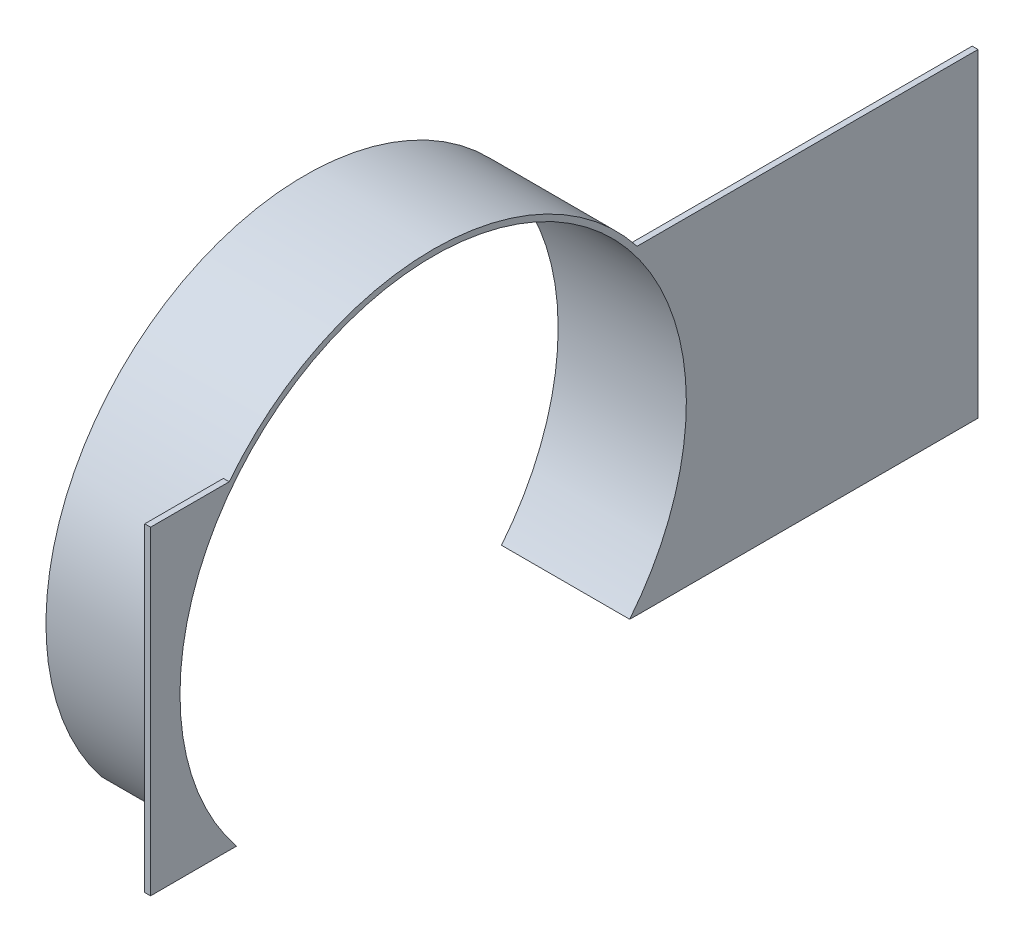
ISO-10303-21;
HEADER;
FILE_DESCRIPTION(('STEP AP214'),'2;1');
FILE_NAME('part.step','',(''),(''),'','','');
FILE_SCHEMA(('AUTOMOTIVE_DESIGN { 1 0 10303 214 1 1 1 1 }'));
ENDSEC;
DATA;
#1=APPLICATION_CONTEXT('core data for automotive mechanical design processes');
#2=APPLICATION_PROTOCOL_DEFINITION('international standard','automotive_design',2000,#1);
#3=PRODUCT_CONTEXT('',#1,'mechanical');
#4=PRODUCT('Part','Part','',(#3));
#5=PRODUCT_RELATED_PRODUCT_CATEGORY('part','',(#4));
#6=PRODUCT_DEFINITION_FORMATION('','',#4);
#7=PRODUCT_DEFINITION_CONTEXT('part definition',#1,'design');
#8=PRODUCT_DEFINITION('design','',#6,#7);
#9=PRODUCT_DEFINITION_SHAPE('','',#8);
#10=(LENGTH_UNIT() NAMED_UNIT(*) SI_UNIT(.MILLI.,.METRE.));
#11=(NAMED_UNIT(*) PLANE_ANGLE_UNIT() SI_UNIT($,.RADIAN.));
#12=(NAMED_UNIT(*) SI_UNIT($,.STERADIAN.) SOLID_ANGLE_UNIT());
#13=UNCERTAINTY_MEASURE_WITH_UNIT(LENGTH_MEASURE(1.E-05),#10,'distance_accuracy_value','');
#14=(GEOMETRIC_REPRESENTATION_CONTEXT(3) GLOBAL_UNCERTAINTY_ASSIGNED_CONTEXT((#13)) GLOBAL_UNIT_ASSIGNED_CONTEXT((#10,
#11,#12)) REPRESENTATION_CONTEXT('',''));
#15=CARTESIAN_POINT('',(0.,0.,0.));
#16=DIRECTION('',(0.,0.,1.));
#17=DIRECTION('',(1.,0.,0.));
#18=AXIS2_PLACEMENT_3D('',#15,#16,#17);
#19=CARTESIAN_POINT('',(-42.000000074,54.7996218405485,24.9974651154864));
#20=DIRECTION('',(1.,0.,0.));
#21=DIRECTION('',(0.,0.,-1.));
#22=AXIS2_PLACEMENT_3D('',#19,#20,#21);
#23=CYLINDRICAL_SURFACE('',#22,88.9);
#24=CARTESIAN_POINT('',(0.,54.7996218405485,24.9974651154864));
#25=DIRECTION('',(1.,0.,0.));
#26=DIRECTION('',(0.,0.,1.));
#27=AXIS2_PLACEMENT_3D('',#24,#25,#26);
#28=CIRCLE('',#27,88.9);
#29=CARTESIAN_POINT('',(0.,0.,-45.0040451977409));
#30=VERTEX_POINT('',#29);
#31=CARTESIAN_POINT('',(0.,109.599999999998,-45.0034531183573));
#32=VERTEX_POINT('',#31);
#33=EDGE_CURVE('E60',#30,#32,#28,.T.);
#34=ORIENTED_EDGE('',*,*,#33,.F.);
#35=DIRECTION('',(1.,0.,0.));
#36=VECTOR('',#35,1.);
#37=CARTESIAN_POINT('',(-42.000000074,0.,-45.0040451977409));
#38=LINE('',#37,#36);
#39=CARTESIAN_POINT('',(-42.000000074,0.,-45.0040451977409));
#40=VERTEX_POINT('',#39);
#41=EDGE_CURVE('E11',#40,#30,#38,.T.);
#42=ORIENTED_EDGE('',*,*,#41,.F.);
#43=CARTESIAN_POINT('',(-42.000000074,54.7996218405485,24.9974651154864));
#44=DIRECTION('',(1.,0.,0.));
#45=DIRECTION('',(0.,0.,1.));
#46=AXIS2_PLACEMENT_3D('',#43,#44,#45);
#47=CIRCLE('',#46,88.9);
#48=CARTESIAN_POINT('',(-42.000000074,0.0447268765814118,95.0339661523381));
#49=VERTEX_POINT('',#48);
#50=EDGE_CURVE('E230',#40,#49,#47,.T.);
#51=ORIENTED_EDGE('',*,*,#50,.T.);
#52=DIRECTION('',(1.,0.,0.));
#53=VECTOR('',#52,1.);
#54=CARTESIAN_POINT('',(-42.000000074,0.0447268765814118,95.0339661523381));
#55=LINE('',#54,#53);
#56=CARTESIAN_POINT('',(0.,0.0447268765814118,95.0339661523381));
#57=VERTEX_POINT('',#56);
#58=EDGE_CURVE('E39',#49,#57,#55,.T.);
#59=ORIENTED_EDGE('',*,*,#58,.T.);
#60=CARTESIAN_POINT('',(0.,109.599999999998,94.9983833493304));
#61=VERTEX_POINT('',#60);
#62=EDGE_CURVE('E52',#61,#57,#28,.T.);
#63=ORIENTED_EDGE('',*,*,#62,.F.);
#64=DIRECTION('',(-1.,0.,0.));
#65=VECTOR('',#64,1.);
#66=CARTESIAN_POINT('',(2.000000064,109.599999999998,94.9983833493304));
#67=LINE('',#66,#65);
#68=CARTESIAN_POINT('',(2.000000064,109.599999999998,94.9983833493304));
#69=VERTEX_POINT('',#68);
#70=EDGE_CURVE('E212',#69,#61,#67,.T.);
#71=ORIENTED_EDGE('',*,*,#70,.F.);
#72=CARTESIAN_POINT('',(2.000000064,54.7996218405485,24.9974651154864));
#73=DIRECTION('',(1.,0.,0.));
#74=DIRECTION('',(0.,0.,-1.));
#75=AXIS2_PLACEMENT_3D('',#72,#73,#74);
#76=CIRCLE('',#75,88.9);
#77=CARTESIAN_POINT('',(2.000000064,109.599999999998,-45.0034531183573));
#78=VERTEX_POINT('',#77);
#79=EDGE_CURVE('E178',#69,#78,#76,.F.);
#80=ORIENTED_EDGE('',*,*,#79,.T.);
#81=DIRECTION('',(-1.,0.,0.));
#82=VECTOR('',#81,1.);
#83=CARTESIAN_POINT('',(2.000000064,109.599999999998,-45.0034531183573));
#84=LINE('',#83,#82);
#85=EDGE_CURVE('E214',#78,#32,#84,.T.);
#86=ORIENTED_EDGE('',*,*,#85,.T.);
#87=EDGE_LOOP('',(#34,#42,#51,#59,#63,#71,#80,#86));
#88=FACE_BOUND('',#87,.T.);
#89=ADVANCED_FACE('F36',(#88),#23,.T.);
#90=CARTESIAN_POINT('',(-42.000000074,-1.80414570459811E-12,-42.4459291867703));
#91=DIRECTION('',(0.,-1.,-7.05262880399394E-13));
#92=DIRECTION('',(0.,7.05262880399394E-13,-1.));
#93=AXIS2_PLACEMENT_3D('',#90,#91,#92);
#94=PLANE('',#93);
#95=DIRECTION('',(0.,7.05262880399394E-13,-1.));
#96=VECTOR('',#95,1.);
#97=CARTESIAN_POINT('',(0.,-1.80414570459811E-12,-42.4459291867703));
#98=LINE('',#97,#96);
#99=CARTESIAN_POINT('',(0.,-1.80414570459811E-12,-42.4459291867703));
#100=VERTEX_POINT('',#99);
#101=EDGE_CURVE('E234',#100,#30,#98,.T.);
#102=ORIENTED_EDGE('',*,*,#101,.F.);
#103=DIRECTION('',(1.,0.,0.));
#104=VECTOR('',#103,1.);
#105=CARTESIAN_POINT('',(-42.000000074,-1.80414570459811E-12,-42.4459291867703));
#106=LINE('',#105,#104);
#107=CARTESIAN_POINT('',(-42.000000074,-1.80414570459811E-12,-42.4459291867703));
#108=VERTEX_POINT('',#107);
#109=EDGE_CURVE('E44',#108,#100,#106,.T.);
#110=ORIENTED_EDGE('',*,*,#109,.F.);
#111=DIRECTION('',(0.,7.05262880399394E-13,-1.));
#112=VECTOR('',#111,1.);
#113=CARTESIAN_POINT('',(-42.000000074,-1.80414570459811E-12,-42.4459291867703));
#114=LINE('',#113,#112);
#115=EDGE_CURVE('E239',#108,#40,#114,.T.);
#116=ORIENTED_EDGE('',*,*,#115,.T.);
#117=ORIENTED_EDGE('',*,*,#41,.T.);
#118=EDGE_LOOP('',(#102,#110,#116,#117));
#119=FACE_BOUND('',#118,.T.);
#120=ADVANCED_FACE('F264',(#119),#94,.T.);
#121=CARTESIAN_POINT('',(-42.000000074,54.7996218405485,24.9974651154864));
#122=DIRECTION('',(1.,0.,0.));
#123=DIRECTION('',(0.,0.,-1.));
#124=AXIS2_PLACEMENT_3D('',#121,#122,#123);
#125=CYLINDRICAL_SURFACE('',#124,86.8999999360005);
#126=ORIENTED_EDGE('',*,*,#109,.T.);
#127=DIRECTION('',(-1.,0.,0.));
#128=VECTOR('',#127,1.);
#129=CARTESIAN_POINT('',(2.000000064,-1.52655665885959E-12,-42.4459291867698));
#130=LINE('',#129,#128);
#131=CARTESIAN_POINT('',(2.000000064,-1.52655665885959E-12,-42.4459291867698));
#132=VERTEX_POINT('',#131);
#133=EDGE_CURVE('E158',#132,#100,#130,.T.);
#134=ORIENTED_EDGE('',*,*,#133,.F.);
#135=CARTESIAN_POINT('',(2.000000064,54.7996218405485,24.9974651154864));
#136=DIRECTION('',(1.,0.,0.));
#137=DIRECTION('',(0.,0.,-1.));
#138=AXIS2_PLACEMENT_3D('',#135,#136,#137);
#139=CIRCLE('',#138,86.8999999360003);
#140=CARTESIAN_POINT('',(2.000000064,0.00325506453346968,92.4435041172338));
#141=VERTEX_POINT('',#140);
#142=EDGE_CURVE('E164',#141,#132,#139,.F.);
#143=ORIENTED_EDGE('',*,*,#142,.F.);
#144=DIRECTION('',(1.,0.,0.));
#145=VECTOR('',#144,1.);
#146=CARTESIAN_POINT('',(-42.000000074,0.00325506453310864,92.4435041172342));
#147=LINE('',#146,#145);
#148=CARTESIAN_POINT('',(-42.000000074,0.00325506453310864,92.4435041172342));
#149=VERTEX_POINT('',#148);
#150=EDGE_CURVE('E162',#149,#141,#147,.T.);
#151=ORIENTED_EDGE('',*,*,#150,.F.);
#152=CARTESIAN_POINT('',(-42.000000074,54.7996218405485,24.9974651154864));
#153=DIRECTION('',(-1.,0.,0.));
#154=DIRECTION('',(0.,0.,1.));
#155=AXIS2_PLACEMENT_3D('',#152,#153,#154);
#156=CIRCLE('',#155,86.8999999360005);
#157=EDGE_CURVE('E236',#149,#108,#156,.T.);
#158=ORIENTED_EDGE('',*,*,#157,.T.);
#159=EDGE_LOOP('',(#126,#134,#143,#151,#158));
#160=FACE_BOUND('',#159,.T.);
#161=ADVANCED_FACE('F282',(#160),#125,.F.);
#162=CARTESIAN_POINT('',(-42.000000074,0.0447268765814118,95.0339661523381));
#163=DIRECTION('',(0.,-0.999871873757214,0.0160073754637418));
#164=DIRECTION('',(0.,-0.0160073754637418,-0.999871873757215));
#165=AXIS2_PLACEMENT_3D('',#162,#163,#164);
#166=PLANE('',#165);
#167=ORIENTED_EDGE('',*,*,#150,.T.);
#168=DIRECTION('',(0.,0.0160073754637418,0.999871873757215));
#169=VECTOR('',#168,1.);
#170=CARTESIAN_POINT('',(2.000000064,-1.47633405074013,0.0236352617573903));
#171=LINE('',#170,#169);
#172=CARTESIAN_POINT('',(2.000000064,0.0447268765814117,95.0339661523381));
#173=VERTEX_POINT('',#172);
#174=EDGE_CURVE('E143',#141,#173,#171,.T.);
#175=ORIENTED_EDGE('',*,*,#174,.T.);
#176=DIRECTION('',(-1.,0.,0.));
#177=VECTOR('',#176,1.);
#178=CARTESIAN_POINT('',(2.000000064,0.0447268765814117,95.0339661523381));
#179=LINE('',#178,#177);
#180=EDGE_CURVE('E153',#173,#57,#179,.T.);
#181=ORIENTED_EDGE('',*,*,#180,.T.);
#182=ORIENTED_EDGE('',*,*,#58,.F.);
#183=DIRECTION('',(0.,-0.0160073754637418,-0.999871873757214));
#184=VECTOR('',#183,1.);
#185=CARTESIAN_POINT('',(-42.000000074,0.0447268765814118,95.0339661523381));
#186=LINE('',#185,#184);
#187=EDGE_CURVE('E233',#49,#149,#186,.T.);
#188=ORIENTED_EDGE('',*,*,#187,.T.);
#189=EDGE_LOOP('',(#167,#175,#181,#182,#188));
#190=FACE_BOUND('',#189,.T.);
#191=ADVANCED_FACE('F160',(#190),#166,.T.);
#192=CARTESIAN_POINT('',(-42.000000074,54.7996218405485,24.9974651154864));
#193=DIRECTION('',(-1.,0.,0.));
#194=DIRECTION('',(0.,0.,1.));
#195=AXIS2_PLACEMENT_3D('',#192,#193,#194);
#196=PLANE('',#195);
#197=ORIENTED_EDGE('',*,*,#50,.F.);
#198=ORIENTED_EDGE('',*,*,#115,.F.);
#199=ORIENTED_EDGE('',*,*,#157,.F.);
#200=ORIENTED_EDGE('',*,*,#187,.F.);
#201=EDGE_LOOP('',(#197,#198,#199,#200));
#202=FACE_BOUND('',#201,.T.);
#203=ADVANCED_FACE('F285',(#202),#196,.T.);
#204=CARTESIAN_POINT('',(0.,0.,0.));
#205=DIRECTION('',(1.,0.,0.));
#206=DIRECTION('',(0.,0.,-1.));
#207=AXIS2_PLACEMENT_3D('',#204,#205,#206);
#208=PLANE('',#207);
#209=DIRECTION('',(0.,0.,-1.));
#210=VECTOR('',#209,1.);
#211=CARTESIAN_POINT('',(0.,109.599999999998,0.));
#212=LINE('',#211,#210);
#213=CARTESIAN_POINT('',(0.,109.599999999999,122.000000064));
#214=VERTEX_POINT('',#213);
#215=EDGE_CURVE('E200',#214,#61,#212,.T.);
#216=ORIENTED_EDGE('',*,*,#215,.T.);
#217=ORIENTED_EDGE('',*,*,#62,.T.);
#218=DIRECTION('',(0.,0.00179150621523461,-0.999998395251453));
#219=VECTOR('',#218,1.);
#220=CARTESIAN_POINT('',(0.,0.214980400836291,0.000385139342303644));
#221=LINE('',#220,#219);
#222=CARTESIAN_POINT('',(0.,-1.82254385194813E-12,120.));
#223=VERTEX_POINT('',#222);
#224=EDGE_CURVE('E156',#223,#57,#221,.T.);
#225=ORIENTED_EDGE('',*,*,#224,.F.);
#226=DIRECTION('',(0.,-3.87554416209851E-13,-1.));
#227=VECTOR('',#226,1.);
#228=CARTESIAN_POINT('',(0.,-4.83290832040583E-11,0.));
#229=LINE('',#228,#227);
#230=CARTESIAN_POINT('',(0.,-1.04744440365136E-12,122.000000064));
#231=VERTEX_POINT('',#230);
#232=EDGE_CURVE('E149',#231,#223,#229,.T.);
#233=ORIENTED_EDGE('',*,*,#232,.F.);
#234=DIRECTION('',(0.,-1.,0.));
#235=VECTOR('',#234,1.);
#236=CARTESIAN_POINT('',(0.,0.,122.000000064));
#237=LINE('',#236,#235);
#238=EDGE_CURVE('E203',#214,#231,#237,.T.);
#239=ORIENTED_EDGE('',*,*,#238,.F.);
#240=EDGE_LOOP('',(#216,#217,#225,#233,#239));
#241=FACE_BOUND('',#240,.T.);
#242=ADVANCED_FACE('F247',(#241),#208,.F.);
#243=ORIENTED_EDGE('',*,*,#101,.T.);
#244=ORIENTED_EDGE('',*,*,#33,.T.);
#245=DIRECTION('',(0.,0.,1.));
#246=VECTOR('',#245,1.);
#247=CARTESIAN_POINT('',(0.,109.600000000001,-6.39263819095105E-12));
#248=LINE('',#247,#246);
#249=CARTESIAN_POINT('',(0.,109.599999999998,-162.000000064));
#250=VERTEX_POINT('',#249);
#251=EDGE_CURVE('E197',#250,#32,#248,.T.);
#252=ORIENTED_EDGE('',*,*,#251,.F.);
#253=DIRECTION('',(0.,1.,0.));
#254=VECTOR('',#253,1.);
#255=CARTESIAN_POINT('',(0.,0.,-162.000000064));
#256=LINE('',#255,#254);
#257=CARTESIAN_POINT('',(0.,0.,-162.000000064));
#258=VERTEX_POINT('',#257);
#259=EDGE_CURVE('E195',#258,#250,#256,.T.);
#260=ORIENTED_EDGE('',*,*,#259,.F.);
#261=DIRECTION('',(0.,9.11276600277221E-13,-1.));
#262=VECTOR('',#261,1.);
#263=CARTESIAN_POINT('',(0.,-1.47626809303231E-10,0.));
#264=LINE('',#263,#262);
#265=CARTESIAN_POINT('',(0.,-1.82255325887613E-12,-160.));
#266=VERTEX_POINT('',#265);
#267=EDGE_CURVE('E193',#266,#258,#264,.T.);
#268=ORIENTED_EDGE('',*,*,#267,.F.);
#269=DIRECTION('',(0.,0.000433098485976413,-0.999999906212847));
#270=VECTOR('',#269,1.);
#271=CARTESIAN_POINT('',(0.,-0.0692957512589967,-3.00118877695991E-05));
#272=LINE('',#271,#270);
#273=CARTESIAN_POINT('',(0.,-0.0498214826879997,-44.9650145942199));
#274=VERTEX_POINT('',#273);
#275=EDGE_CURVE('E191',#274,#266,#272,.T.);
#276=ORIENTED_EDGE('',*,*,#275,.F.);
#277=DIRECTION('',(0.,-0.0197737406864263,-0.999804480475691));
#278=VECTOR('',#277,1.);
#279=CARTESIAN_POINT('',(0.,0.83915069450223,-0.0165963931488153));
#280=LINE('',#279,#278);
#281=EDGE_CURVE('E189',#100,#274,#280,.T.);
#282=ORIENTED_EDGE('',*,*,#281,.F.);
#283=EDGE_LOOP('',(#243,#244,#252,#260,#268,#276,#282));
#284=FACE_BOUND('',#283,.T.);
#285=ADVANCED_FACE('F267',(#284),#208,.F.);
#286=CARTESIAN_POINT('',(2.000000064,0.214980400836291,0.000385139342303644));
#287=DIRECTION('',(0.,0.999998395251453,0.00179150621523461));
#288=DIRECTION('',(0.,-0.00179150621523461,0.999998395251453));
#289=AXIS2_PLACEMENT_3D('',#286,#287,#288);
#290=PLANE('',#289);
#291=ORIENTED_EDGE('',*,*,#224,.T.);
#292=ORIENTED_EDGE('',*,*,#180,.F.);
#293=DIRECTION('',(0.,0.00179150621523461,-0.999998395251453));
#294=VECTOR('',#293,1.);
#295=CARTESIAN_POINT('',(2.000000064,0.214980400836291,0.000385139342303644));
#296=LINE('',#295,#294);
#297=CARTESIAN_POINT('',(2.000000064,-1.82254385194813E-12,120.));
#298=VERTEX_POINT('',#297);
#299=EDGE_CURVE('E139',#298,#173,#296,.T.);
#300=ORIENTED_EDGE('',*,*,#299,.F.);
#301=DIRECTION('',(-1.,0.,0.));
#302=VECTOR('',#301,1.);
#303=CARTESIAN_POINT('',(2.000000064,-1.82254385194813E-12,120.));
#304=LINE('',#303,#302);
#305=EDGE_CURVE('E187',#298,#223,#304,.T.);
#306=ORIENTED_EDGE('',*,*,#305,.T.);
#307=EDGE_LOOP('',(#291,#292,#300,#306));
#308=FACE_BOUND('',#307,.T.);
#309=ADVANCED_FACE('F154',(#308),#290,.F.);
#310=CARTESIAN_POINT('',(2.000000064,0.83915069450223,-0.0165963931488153));
#311=DIRECTION('',(0.,0.999804480475691,-0.0197737406864263));
#312=DIRECTION('',(0.,0.0197737406864263,0.999804480475691));
#313=AXIS2_PLACEMENT_3D('',#310,#311,#312);
#314=PLANE('',#313);
#315=ORIENTED_EDGE('',*,*,#281,.T.);
#316=DIRECTION('',(-1.,0.,0.));
#317=VECTOR('',#316,1.);
#318=CARTESIAN_POINT('',(2.000000064,-0.0498214826879997,-44.9650145942199));
#319=LINE('',#318,#317);
#320=CARTESIAN_POINT('',(2.000000064,-0.0498214826879997,-44.9650145942199));
#321=VERTEX_POINT('',#320);
#322=EDGE_CURVE('E225',#321,#274,#319,.T.);
#323=ORIENTED_EDGE('',*,*,#322,.F.);
#324=DIRECTION('',(0.,-0.0197737406864263,-0.999804480475691));
#325=VECTOR('',#324,1.);
#326=CARTESIAN_POINT('',(2.000000064,0.83915069450223,-0.0165963931488153));
#327=LINE('',#326,#325);
#328=EDGE_CURVE('E166',#132,#321,#327,.T.);
#329=ORIENTED_EDGE('',*,*,#328,.F.);
#330=ORIENTED_EDGE('',*,*,#133,.T.);
#331=EDGE_LOOP('',(#315,#323,#329,#330));
#332=FACE_BOUND('',#331,.T.);
#333=ADVANCED_FACE('F272',(#332),#314,.F.);
#334=CARTESIAN_POINT('',(2.000000064,-0.0692957512589967,-3.00118877695991E-05));
#335=DIRECTION('',(0.,0.999999906212846,0.000433098485976413));
#336=DIRECTION('',(0.,-0.000433098485976413,0.999999906212847));
#337=AXIS2_PLACEMENT_3D('',#334,#335,#336);
#338=PLANE('',#337);
#339=ORIENTED_EDGE('',*,*,#275,.T.);
#340=DIRECTION('',(-1.,0.,0.));
#341=VECTOR('',#340,1.);
#342=CARTESIAN_POINT('',(2.000000064,-1.82255325887613E-12,-160.));
#343=LINE('',#342,#341);
#344=CARTESIAN_POINT('',(2.000000064,-1.82255325887613E-12,-160.));
#345=VERTEX_POINT('',#344);
#346=EDGE_CURVE('E222',#345,#266,#343,.T.);
#347=ORIENTED_EDGE('',*,*,#346,.F.);
#348=DIRECTION('',(0.,0.000433098485976413,-0.999999906212847));
#349=VECTOR('',#348,1.);
#350=CARTESIAN_POINT('',(2.000000064,-0.0692957512589967,-3.00118877695991E-05));
#351=LINE('',#350,#349);
#352=EDGE_CURVE('E170',#321,#345,#351,.T.);
#353=ORIENTED_EDGE('',*,*,#352,.F.);
#354=ORIENTED_EDGE('',*,*,#322,.T.);
#355=EDGE_LOOP('',(#339,#347,#353,#354));
#356=FACE_BOUND('',#355,.T.);
#357=ADVANCED_FACE('F277',(#356),#338,.F.);
#358=CARTESIAN_POINT('',(2.000000064,-1.47626809303231E-10,0.));
#359=DIRECTION('',(0.,1.,9.11276600277221E-13));
#360=DIRECTION('',(0.,-9.11276600277221E-13,1.));
#361=AXIS2_PLACEMENT_3D('',#358,#359,#360);
#362=PLANE('',#361);
#363=ORIENTED_EDGE('',*,*,#267,.T.);
#364=DIRECTION('',(-1.,0.,0.));
#365=VECTOR('',#364,1.);
#366=CARTESIAN_POINT('',(2.000000064,0.,-162.000000064));
#367=LINE('',#366,#365);
#368=CARTESIAN_POINT('',(2.000000064,0.,-162.000000064));
#369=VERTEX_POINT('',#368);
#370=EDGE_CURVE('E219',#369,#258,#367,.T.);
#371=ORIENTED_EDGE('',*,*,#370,.F.);
#372=DIRECTION('',(0.,9.11276600277221E-13,-1.));
#373=VECTOR('',#372,1.);
#374=CARTESIAN_POINT('',(2.000000064,-1.47626809303231E-10,0.));
#375=LINE('',#374,#373);
#376=EDGE_CURVE('E172',#345,#369,#375,.T.);
#377=ORIENTED_EDGE('',*,*,#376,.F.);
#378=ORIENTED_EDGE('',*,*,#346,.T.);
#379=EDGE_LOOP('',(#363,#371,#377,#378));
#380=FACE_BOUND('',#379,.T.);
#381=ADVANCED_FACE('F351',(#380),#362,.F.);
#382=CARTESIAN_POINT('',(2.000000064,0.,-162.000000064));
#383=DIRECTION('',(0.,0.,1.));
#384=DIRECTION('',(1.,0.,0.));
#385=AXIS2_PLACEMENT_3D('',#382,#383,#384);
#386=PLANE('',#385);
#387=ORIENTED_EDGE('',*,*,#259,.T.);
#388=DIRECTION('',(-1.,0.,0.));
#389=VECTOR('',#388,1.);
#390=CARTESIAN_POINT('',(2.000000064,109.599999999998,-162.000000064));
#391=LINE('',#390,#389);
#392=CARTESIAN_POINT('',(2.000000064,109.599999999998,-162.000000064));
#393=VERTEX_POINT('',#392);
#394=EDGE_CURVE('E216',#393,#250,#391,.T.);
#395=ORIENTED_EDGE('',*,*,#394,.F.);
#396=DIRECTION('',(0.,1.,0.));
#397=VECTOR('',#396,1.);
#398=CARTESIAN_POINT('',(2.000000064,0.,-162.000000064));
#399=LINE('',#398,#397);
#400=EDGE_CURVE('E174',#369,#393,#399,.T.);
#401=ORIENTED_EDGE('',*,*,#400,.F.);
#402=ORIENTED_EDGE('',*,*,#370,.T.);
#403=EDGE_LOOP('',(#387,#395,#401,#402));
#404=FACE_BOUND('',#403,.T.);
#405=ADVANCED_FACE('F360',(#404),#386,.F.);
#406=CARTESIAN_POINT('',(2.000000064,109.600000000001,-6.39263819095105E-12));
#407=DIRECTION('',(0.,-1.,0.));
#408=DIRECTION('',(0.,0.,-1.));
#409=AXIS2_PLACEMENT_3D('',#406,#407,#408);
#410=PLANE('',#409);
#411=ORIENTED_EDGE('',*,*,#251,.T.);
#412=ORIENTED_EDGE('',*,*,#85,.F.);
#413=DIRECTION('',(0.,0.,1.));
#414=VECTOR('',#413,1.);
#415=CARTESIAN_POINT('',(2.000000064,109.600000000001,-6.39263819095105E-12));
#416=LINE('',#415,#414);
#417=EDGE_CURVE('E176',#393,#78,#416,.T.);
#418=ORIENTED_EDGE('',*,*,#417,.F.);
#419=ORIENTED_EDGE('',*,*,#394,.T.);
#420=EDGE_LOOP('',(#411,#412,#418,#419));
#421=FACE_BOUND('',#420,.T.);
#422=ADVANCED_FACE('F261',(#421),#410,.F.);
#423=CARTESIAN_POINT('',(2.000000064,109.599999999998,0.));
#424=DIRECTION('',(0.,1.,0.));
#425=DIRECTION('',(0.,0.,1.));
#426=AXIS2_PLACEMENT_3D('',#423,#424,#425);
#427=PLANE('',#426);
#428=ORIENTED_EDGE('',*,*,#215,.F.);
#429=DIRECTION('',(-1.,0.,0.));
#430=VECTOR('',#429,1.);
#431=CARTESIAN_POINT('',(2.000000064,109.599999999999,122.000000064));
#432=LINE('',#431,#430);
#433=CARTESIAN_POINT('',(2.000000064,109.599999999999,122.000000064));
#434=VERTEX_POINT('',#433);
#435=EDGE_CURVE('E210',#434,#214,#432,.T.);
#436=ORIENTED_EDGE('',*,*,#435,.F.);
#437=DIRECTION('',(0.,0.,-1.));
#438=VECTOR('',#437,1.);
#439=CARTESIAN_POINT('',(2.000000064,109.599999999998,0.));
#440=LINE('',#439,#438);
#441=EDGE_CURVE('E181',#434,#69,#440,.T.);
#442=ORIENTED_EDGE('',*,*,#441,.T.);
#443=ORIENTED_EDGE('',*,*,#70,.T.);
#444=EDGE_LOOP('',(#428,#436,#442,#443));
#445=FACE_BOUND('',#444,.T.);
#446=ADVANCED_FACE('F252',(#445),#427,.T.);
#447=CARTESIAN_POINT('',(2.000000064,0.,122.000000064));
#448=DIRECTION('',(0.,0.,-1.));
#449=DIRECTION('',(0.,1.,0.));
#450=AXIS2_PLACEMENT_3D('',#447,#448,#449);
#451=PLANE('',#450);
#452=ORIENTED_EDGE('',*,*,#238,.T.);
#453=DIRECTION('',(-1.,0.,0.));
#454=VECTOR('',#453,1.);
#455=CARTESIAN_POINT('',(2.000000064,-1.04744440365136E-12,122.000000064));
#456=LINE('',#455,#454);
#457=CARTESIAN_POINT('',(2.000000064,-1.04744440365136E-12,122.000000064));
#458=VERTEX_POINT('',#457);
#459=EDGE_CURVE('E207',#458,#231,#456,.T.);
#460=ORIENTED_EDGE('',*,*,#459,.F.);
#461=DIRECTION('',(0.,-1.,0.));
#462=VECTOR('',#461,1.);
#463=CARTESIAN_POINT('',(2.000000064,0.,122.000000064));
#464=LINE('',#463,#462);
#465=EDGE_CURVE('E184',#434,#458,#464,.T.);
#466=ORIENTED_EDGE('',*,*,#465,.F.);
#467=ORIENTED_EDGE('',*,*,#435,.T.);
#468=EDGE_LOOP('',(#452,#460,#466,#467));
#469=FACE_BOUND('',#468,.T.);
#470=ADVANCED_FACE('F390',(#469),#451,.F.);
#471=CARTESIAN_POINT('',(2.000000064,-4.83290832040583E-11,0.));
#472=DIRECTION('',(0.,1.,-3.87554416209851E-13));
#473=DIRECTION('',(0.,3.87554416209851E-13,1.));
#474=AXIS2_PLACEMENT_3D('',#471,#472,#473);
#475=PLANE('',#474);
#476=ORIENTED_EDGE('',*,*,#232,.T.);
#477=ORIENTED_EDGE('',*,*,#305,.F.);
#478=DIRECTION('',(0.,-3.87554416209851E-13,-1.));
#479=VECTOR('',#478,1.);
#480=CARTESIAN_POINT('',(2.000000064,-4.83290832040583E-11,0.));
#481=LINE('',#480,#479);
#482=EDGE_CURVE('E145',#458,#298,#481,.T.);
#483=ORIENTED_EDGE('',*,*,#482,.F.);
#484=ORIENTED_EDGE('',*,*,#459,.T.);
#485=EDGE_LOOP('',(#476,#477,#483,#484));
#486=FACE_BOUND('',#485,.T.);
#487=ADVANCED_FACE('F399',(#486),#475,.F.);
#488=CARTESIAN_POINT('',(2.000000064,0.,0.));
#489=DIRECTION('',(1.,0.,0.));
#490=DIRECTION('',(0.,0.,-1.));
#491=AXIS2_PLACEMENT_3D('',#488,#489,#490);
#492=PLANE('',#491);
#493=ORIENTED_EDGE('',*,*,#299,.T.);
#494=ORIENTED_EDGE('',*,*,#174,.F.);
#495=ORIENTED_EDGE('',*,*,#142,.T.);
#496=ORIENTED_EDGE('',*,*,#328,.T.);
#497=ORIENTED_EDGE('',*,*,#352,.T.);
#498=ORIENTED_EDGE('',*,*,#376,.T.);
#499=ORIENTED_EDGE('',*,*,#400,.T.);
#500=ORIENTED_EDGE('',*,*,#417,.T.);
#501=ORIENTED_EDGE('',*,*,#79,.F.);
#502=ORIENTED_EDGE('',*,*,#441,.F.);
#503=ORIENTED_EDGE('',*,*,#465,.T.);
#504=ORIENTED_EDGE('',*,*,#482,.T.);
#505=EDGE_LOOP('',(#493,#494,#495,#496,#497,#498,#499,#500,#501,#502,#503,#504));
#506=FACE_BOUND('',#505,.T.);
#507=ADVANCED_FACE('F141',(#506),#492,.T.);
#508=CLOSED_SHELL('',(#89,#120,#161,#191,#203,#242,#285,#309,#333,#357,#381,#405,#422,#446,#470,
#487,#507));
#509=MANIFOLD_SOLID_BREP('B2',#508);
#510=ADVANCED_BREP_SHAPE_REPRESENTATION('',(#18,#509),#14);
#511=SHAPE_DEFINITION_REPRESENTATION(#9,#510);
ENDSEC;
END-ISO-10303-21;
